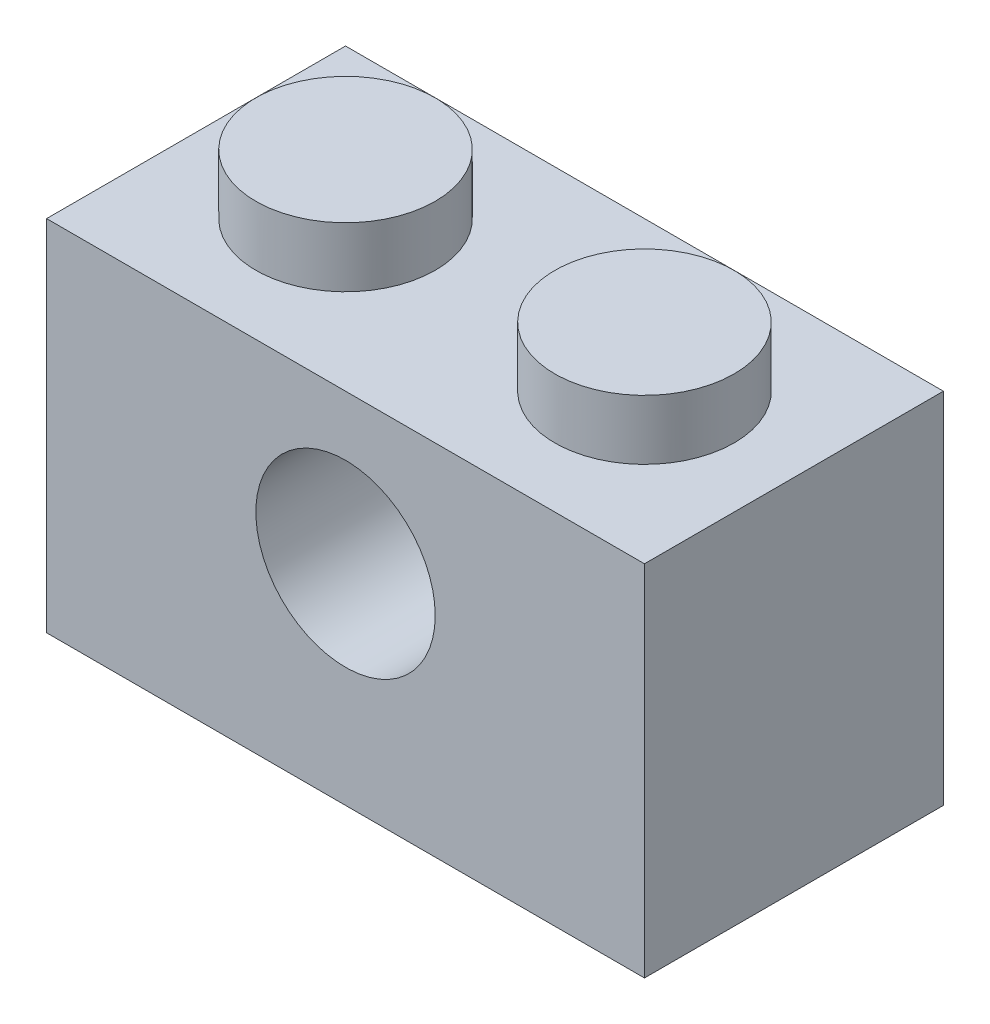
ISO-10303-21;
HEADER;
FILE_DESCRIPTION(('STEP AP214'),'2;1');
FILE_NAME('part.step','',(''),(''),'','','');
FILE_SCHEMA(('AUTOMOTIVE_DESIGN { 1 0 10303 214 1 1 1 1 }'));
ENDSEC;
DATA;
#1=APPLICATION_CONTEXT('core data for automotive mechanical design processes');
#2=APPLICATION_PROTOCOL_DEFINITION('international standard','automotive_design',2000,#1);
#3=PRODUCT_CONTEXT('',#1,'mechanical');
#4=PRODUCT('Part','Part','',(#3));
#5=PRODUCT_RELATED_PRODUCT_CATEGORY('part','',(#4));
#6=PRODUCT_DEFINITION_FORMATION('','',#4);
#7=PRODUCT_DEFINITION_CONTEXT('part definition',#1,'design');
#8=PRODUCT_DEFINITION('design','',#6,#7);
#9=PRODUCT_DEFINITION_SHAPE('','',#8);
#10=(LENGTH_UNIT() NAMED_UNIT(*) SI_UNIT(.MILLI.,.METRE.));
#11=(NAMED_UNIT(*) PLANE_ANGLE_UNIT() SI_UNIT($,.RADIAN.));
#12=(NAMED_UNIT(*) SI_UNIT($,.STERADIAN.) SOLID_ANGLE_UNIT());
#13=UNCERTAINTY_MEASURE_WITH_UNIT(LENGTH_MEASURE(1.E-05),#10,'distance_accuracy_value','');
#14=(GEOMETRIC_REPRESENTATION_CONTEXT(3) GLOBAL_UNCERTAINTY_ASSIGNED_CONTEXT((#13)) GLOBAL_UNIT_ASSIGNED_CONTEXT((#10,
#11,#12)) REPRESENTATION_CONTEXT('',''));
#15=CARTESIAN_POINT('',(0.,0.,0.));
#16=DIRECTION('',(0.,0.,1.));
#17=DIRECTION('',(1.,0.,0.));
#18=AXIS2_PLACEMENT_3D('',#15,#16,#17);
#19=CARTESIAN_POINT('',(12.,4.8,0.));
#20=DIRECTION('',(-1.,0.,0.));
#21=DIRECTION('',(0.,0.,1.));
#22=AXIS2_PLACEMENT_3D('',#19,#20,#21);
#23=PLANE('',#22);
#24=DIRECTION('',(0.,0.,-1.));
#25=VECTOR('',#24,1.);
#26=CARTESIAN_POINT('',(12.,0.,0.));
#27=LINE('',#26,#25);
#28=CARTESIAN_POINT('',(12.,0.,4.));
#29=VERTEX_POINT('',#28);
#30=CARTESIAN_POINT('',(12.,0.,-4.));
#31=VERTEX_POINT('',#30);
#32=EDGE_CURVE('E133',#29,#31,#27,.T.);
#33=ORIENTED_EDGE('',*,*,#32,.T.);
#34=DIRECTION('',(0.,-1.,0.));
#35=VECTOR('',#34,1.);
#36=CARTESIAN_POINT('',(12.,4.8,-4.));
#37=LINE('',#36,#35);
#38=CARTESIAN_POINT('',(12.,9.6,-4.));
#39=VERTEX_POINT('',#38);
#40=EDGE_CURVE('E143',#39,#31,#37,.T.);
#41=ORIENTED_EDGE('',*,*,#40,.F.);
#42=DIRECTION('',(0.,0.,-1.));
#43=VECTOR('',#42,1.);
#44=CARTESIAN_POINT('',(12.,9.6,0.));
#45=LINE('',#44,#43);
#46=CARTESIAN_POINT('',(12.,9.6,4.));
#47=VERTEX_POINT('',#46);
#48=EDGE_CURVE('E11',#47,#39,#45,.T.);
#49=ORIENTED_EDGE('',*,*,#48,.F.);
#50=DIRECTION('',(0.,1.,0.));
#51=VECTOR('',#50,1.);
#52=CARTESIAN_POINT('',(12.,4.8,4.));
#53=LINE('',#52,#51);
#54=EDGE_CURVE('E118',#29,#47,#53,.T.);
#55=ORIENTED_EDGE('',*,*,#54,.F.);
#56=EDGE_LOOP('',(#33,#41,#49,#55));
#57=FACE_BOUND('',#56,.T.);
#58=ADVANCED_FACE('F40',(#57),#23,.F.);
#59=CARTESIAN_POINT('',(4.,9.6,0.));
#60=DIRECTION('',(0.,-1.,0.));
#61=DIRECTION('',(0.,0.,-1.));
#62=AXIS2_PLACEMENT_3D('',#59,#60,#61);
#63=PLANE('',#62);
#64=ORIENTED_EDGE('',*,*,#48,.T.);
#65=DIRECTION('',(1.,0.,0.));
#66=VECTOR('',#65,1.);
#67=CARTESIAN_POINT('',(4.,9.6,-4.));
#68=LINE('',#67,#66);
#69=CARTESIAN_POINT('',(-4.,9.6,-4.));
#70=VERTEX_POINT('',#69);
#71=EDGE_CURVE('E131',#70,#39,#68,.T.);
#72=ORIENTED_EDGE('',*,*,#71,.F.);
#73=DIRECTION('',(0.,0.,-1.));
#74=VECTOR('',#73,1.);
#75=CARTESIAN_POINT('',(-4.,9.6,0.));
#76=LINE('',#75,#74);
#77=CARTESIAN_POINT('',(-4.,9.6,4.));
#78=VERTEX_POINT('',#77);
#79=EDGE_CURVE('E50',#78,#70,#76,.T.);
#80=ORIENTED_EDGE('',*,*,#79,.F.);
#81=DIRECTION('',(-1.,0.,0.));
#82=VECTOR('',#81,1.);
#83=CARTESIAN_POINT('',(4.,9.6,4.));
#84=LINE('',#83,#82);
#85=EDGE_CURVE('E142',#47,#78,#84,.T.);
#86=ORIENTED_EDGE('',*,*,#85,.F.);
#87=EDGE_LOOP('',(#64,#72,#80,#86));
#88=FACE_BOUND('',#87,.T.);
#89=CARTESIAN_POINT('',(0.,9.6,0.));
#90=DIRECTION('',(0.,-1.,0.));
#91=DIRECTION('',(1.,0.,0.));
#92=AXIS2_PLACEMENT_3D('',#89,#90,#91);
#93=CIRCLE('',#92,2.4);
#94=CARTESIAN_POINT('',(-2.4,9.6,0.));
#95=VERTEX_POINT('',#94);
#96=EDGE_CURVE('E115',#95,#95,#93,.T.);
#97=ORIENTED_EDGE('',*,*,#96,.T.);
#98=EDGE_LOOP('',(#97));
#99=FACE_BOUND('',#98,.T.);
#100=CARTESIAN_POINT('',(8.,9.6,0.));
#101=DIRECTION('',(0.,-1.,0.));
#102=DIRECTION('',(1.,0.,0.));
#103=AXIS2_PLACEMENT_3D('',#100,#101,#102);
#104=CIRCLE('',#103,2.4);
#105=CARTESIAN_POINT('',(5.6,9.6,0.));
#106=VERTEX_POINT('',#105);
#107=EDGE_CURVE('E116',#106,#106,#104,.T.);
#108=ORIENTED_EDGE('',*,*,#107,.T.);
#109=EDGE_LOOP('',(#108));
#110=FACE_BOUND('',#109,.T.);
#111=ADVANCED_FACE('F167',(#88,#99,#110),#63,.F.);
#112=CARTESIAN_POINT('',(-4.,4.8,0.));
#113=DIRECTION('',(1.,0.,0.));
#114=DIRECTION('',(0.,0.,-1.));
#115=AXIS2_PLACEMENT_3D('',#112,#113,#114);
#116=PLANE('',#115);
#117=ORIENTED_EDGE('',*,*,#79,.T.);
#118=DIRECTION('',(0.,1.,0.));
#119=VECTOR('',#118,1.);
#120=CARTESIAN_POINT('',(-4.,4.8,-4.));
#121=LINE('',#120,#119);
#122=CARTESIAN_POINT('',(-4.,0.,-4.));
#123=VERTEX_POINT('',#122);
#124=EDGE_CURVE('E148',#123,#70,#121,.T.);
#125=ORIENTED_EDGE('',*,*,#124,.F.);
#126=DIRECTION('',(0.,0.,-1.));
#127=VECTOR('',#126,1.);
#128=CARTESIAN_POINT('',(-4.,0.,0.));
#129=LINE('',#128,#127);
#130=CARTESIAN_POINT('',(-4.,0.,4.));
#131=VERTEX_POINT('',#130);
#132=EDGE_CURVE('E134',#131,#123,#129,.T.);
#133=ORIENTED_EDGE('',*,*,#132,.F.);
#134=DIRECTION('',(0.,-1.,0.));
#135=VECTOR('',#134,1.);
#136=CARTESIAN_POINT('',(-4.,4.8,4.));
#137=LINE('',#136,#135);
#138=EDGE_CURVE('E153',#78,#131,#137,.T.);
#139=ORIENTED_EDGE('',*,*,#138,.F.);
#140=EDGE_LOOP('',(#117,#125,#133,#139));
#141=FACE_BOUND('',#140,.T.);
#142=ADVANCED_FACE('F165',(#141),#116,.F.);
#143=CARTESIAN_POINT('',(4.,0.,0.));
#144=DIRECTION('',(0.,1.,0.));
#145=DIRECTION('',(0.,0.,1.));
#146=AXIS2_PLACEMENT_3D('',#143,#144,#145);
#147=PLANE('',#146);
#148=ORIENTED_EDGE('',*,*,#132,.T.);
#149=DIRECTION('',(-1.,0.,0.));
#150=VECTOR('',#149,1.);
#151=CARTESIAN_POINT('',(4.,0.,-4.));
#152=LINE('',#151,#150);
#153=EDGE_CURVE('E146',#31,#123,#152,.T.);
#154=ORIENTED_EDGE('',*,*,#153,.F.);
#155=ORIENTED_EDGE('',*,*,#32,.F.);
#156=DIRECTION('',(1.,0.,0.));
#157=VECTOR('',#156,1.);
#158=CARTESIAN_POINT('',(4.,0.,4.));
#159=LINE('',#158,#157);
#160=EDGE_CURVE('E147',#131,#29,#159,.T.);
#161=ORIENTED_EDGE('',*,*,#160,.F.);
#162=EDGE_LOOP('',(#148,#154,#155,#161));
#163=FACE_BOUND('',#162,.T.);
#164=CARTESIAN_POINT('',(0.,0.,0.));
#165=DIRECTION('',(0.,1.,0.));
#166=DIRECTION('',(1.,0.,0.));
#167=AXIS2_PLACEMENT_3D('',#164,#165,#166);
#168=CIRCLE('',#167,2.4);
#169=CARTESIAN_POINT('',(-2.4,0.,0.));
#170=VERTEX_POINT('',#169);
#171=EDGE_CURVE('E122',#170,#170,#168,.T.);
#172=ORIENTED_EDGE('',*,*,#171,.T.);
#173=EDGE_LOOP('',(#172));
#174=FACE_BOUND('',#173,.T.);
#175=CARTESIAN_POINT('',(8.,0.,0.));
#176=DIRECTION('',(0.,1.,0.));
#177=DIRECTION('',(1.,0.,0.));
#178=AXIS2_PLACEMENT_3D('',#175,#176,#177);
#179=CIRCLE('',#178,2.4);
#180=CARTESIAN_POINT('',(5.6,0.,0.));
#181=VERTEX_POINT('',#180);
#182=EDGE_CURVE('E128',#181,#181,#179,.T.);
#183=ORIENTED_EDGE('',*,*,#182,.T.);
#184=EDGE_LOOP('',(#183));
#185=FACE_BOUND('',#184,.T.);
#186=ADVANCED_FACE('F163',(#163,#174,#185),#147,.F.);
#187=CARTESIAN_POINT('',(4.,4.8,-4.));
#188=DIRECTION('',(0.,0.,1.));
#189=DIRECTION('',(1.,0.,0.));
#190=AXIS2_PLACEMENT_3D('',#187,#188,#189);
#191=PLANE('',#190);
#192=CARTESIAN_POINT('',(4.,5.6,-4.));
#193=DIRECTION('',(0.,0.,1.));
#194=DIRECTION('',(1.,0.,0.));
#195=AXIS2_PLACEMENT_3D('',#192,#193,#194);
#196=CIRCLE('',#195,2.4);
#197=CARTESIAN_POINT('',(6.4,5.6,-4.));
#198=VERTEX_POINT('',#197);
#199=EDGE_CURVE('E306',#198,#198,#196,.T.);
#200=ORIENTED_EDGE('',*,*,#199,.T.);
#201=EDGE_LOOP('',(#200));
#202=FACE_BOUND('',#201,.T.);
#203=ORIENTED_EDGE('',*,*,#40,.T.);
#204=ORIENTED_EDGE('',*,*,#153,.T.);
#205=ORIENTED_EDGE('',*,*,#124,.T.);
#206=ORIENTED_EDGE('',*,*,#71,.T.);
#207=EDGE_LOOP('',(#203,#204,#205,#206));
#208=FACE_BOUND('',#207,.T.);
#209=ADVANCED_FACE('F160',(#202,#208),#191,.F.);
#210=CARTESIAN_POINT('',(4.,4.8,4.));
#211=DIRECTION('',(0.,0.,1.));
#212=DIRECTION('',(1.,0.,0.));
#213=AXIS2_PLACEMENT_3D('',#210,#211,#212);
#214=PLANE('',#213);
#215=CARTESIAN_POINT('',(4.,5.6,4.));
#216=DIRECTION('',(0.,0.,1.));
#217=DIRECTION('',(1.,0.,0.));
#218=AXIS2_PLACEMENT_3D('',#215,#216,#217);
#219=CIRCLE('',#218,2.4);
#220=CARTESIAN_POINT('',(6.4,5.6,4.));
#221=VERTEX_POINT('',#220);
#222=EDGE_CURVE('E44',#221,#221,#219,.T.);
#223=ORIENTED_EDGE('',*,*,#222,.F.);
#224=EDGE_LOOP('',(#223));
#225=FACE_BOUND('',#224,.T.);
#226=ORIENTED_EDGE('',*,*,#54,.T.);
#227=ORIENTED_EDGE('',*,*,#85,.T.);
#228=ORIENTED_EDGE('',*,*,#138,.T.);
#229=ORIENTED_EDGE('',*,*,#160,.T.);
#230=EDGE_LOOP('',(#226,#227,#228,#229));
#231=FACE_BOUND('',#230,.T.);
#232=ADVANCED_FACE('F201',(#225,#231),#214,.T.);
#233=CARTESIAN_POINT('',(0.,11.2,0.));
#234=DIRECTION('',(0.,1.,0.));
#235=DIRECTION('',(1.,0.,0.));
#236=AXIS2_PLACEMENT_3D('',#233,#234,#235);
#237=PLANE('',#236);
#238=CARTESIAN_POINT('',(0.,11.2,0.));
#239=DIRECTION('',(0.,1.,0.));
#240=DIRECTION('',(1.,0.,0.));
#241=AXIS2_PLACEMENT_3D('',#238,#239,#240);
#242=CIRCLE('',#241,2.4);
#243=CARTESIAN_POINT('',(2.4,11.2,0.));
#244=VERTEX_POINT('',#243);
#245=EDGE_CURVE('E112',#244,#244,#242,.T.);
#246=ORIENTED_EDGE('',*,*,#245,.T.);
#247=EDGE_LOOP('',(#246));
#248=FACE_BOUND('',#247,.T.);
#249=ADVANCED_FACE('F113',(#248),#237,.T.);
#250=CARTESIAN_POINT('',(0.,10.15,0.));
#251=DIRECTION('',(0.,-1.,0.));
#252=DIRECTION('',(1.,0.,0.));
#253=AXIS2_PLACEMENT_3D('',#250,#251,#252);
#254=CYLINDRICAL_SURFACE('',#253,2.4);
#255=ORIENTED_EDGE('',*,*,#96,.F.);
#256=EDGE_LOOP('',(#255));
#257=FACE_BOUND('',#256,.T.);
#258=ORIENTED_EDGE('',*,*,#245,.F.);
#259=EDGE_LOOP('',(#258));
#260=FACE_BOUND('',#259,.T.);
#261=ADVANCED_FACE('F186',(#257,#260),#254,.T.);
#262=CARTESIAN_POINT('',(8.,11.2,0.));
#263=DIRECTION('',(0.,1.,0.));
#264=DIRECTION('',(1.,0.,0.));
#265=AXIS2_PLACEMENT_3D('',#262,#263,#264);
#266=PLANE('',#265);
#267=CARTESIAN_POINT('',(8.,11.2,0.));
#268=DIRECTION('',(0.,1.,0.));
#269=DIRECTION('',(1.,0.,0.));
#270=AXIS2_PLACEMENT_3D('',#267,#268,#269);
#271=CIRCLE('',#270,2.4);
#272=CARTESIAN_POINT('',(10.4,11.2,0.));
#273=VERTEX_POINT('',#272);
#274=EDGE_CURVE('E106',#273,#273,#271,.T.);
#275=ORIENTED_EDGE('',*,*,#274,.T.);
#276=EDGE_LOOP('',(#275));
#277=FACE_BOUND('',#276,.T.);
#278=ADVANCED_FACE('F42',(#277),#266,.T.);
#279=CARTESIAN_POINT('',(8.,10.15,0.));
#280=DIRECTION('',(0.,-1.,0.));
#281=DIRECTION('',(1.,0.,0.));
#282=AXIS2_PLACEMENT_3D('',#279,#280,#281);
#283=CYLINDRICAL_SURFACE('',#282,2.4);
#284=ORIENTED_EDGE('',*,*,#107,.F.);
#285=EDGE_LOOP('',(#284));
#286=FACE_BOUND('',#285,.T.);
#287=ORIENTED_EDGE('',*,*,#274,.F.);
#288=EDGE_LOOP('',(#287));
#289=FACE_BOUND('',#288,.T.);
#290=ADVANCED_FACE('F189',(#286,#289),#283,.T.);
#291=CARTESIAN_POINT('',(0.,1.6,0.));
#292=DIRECTION('',(0.,1.,0.));
#293=DIRECTION('',(1.,0.,0.));
#294=AXIS2_PLACEMENT_3D('',#291,#292,#293);
#295=PLANE('',#294);
#296=CARTESIAN_POINT('',(0.,1.6,0.));
#297=DIRECTION('',(0.,1.,0.));
#298=DIRECTION('',(1.,0.,0.));
#299=AXIS2_PLACEMENT_3D('',#296,#297,#298);
#300=CIRCLE('',#299,2.4);
#301=CARTESIAN_POINT('',(2.4,1.6,0.));
#302=VERTEX_POINT('',#301);
#303=EDGE_CURVE('E100',#302,#302,#300,.T.);
#304=ORIENTED_EDGE('',*,*,#303,.F.);
#305=EDGE_LOOP('',(#304));
#306=FACE_BOUND('',#305,.T.);
#307=ADVANCED_FACE('F192',(#306),#295,.F.);
#308=CARTESIAN_POINT('',(0.,0.55,0.));
#309=DIRECTION('',(0.,-1.,0.));
#310=DIRECTION('',(1.,0.,0.));
#311=AXIS2_PLACEMENT_3D('',#308,#309,#310);
#312=CYLINDRICAL_SURFACE('',#311,2.4);
#313=ORIENTED_EDGE('',*,*,#303,.T.);
#314=EDGE_LOOP('',(#313));
#315=FACE_BOUND('',#314,.T.);
#316=ORIENTED_EDGE('',*,*,#171,.F.);
#317=EDGE_LOOP('',(#316));
#318=FACE_BOUND('',#317,.T.);
#319=ADVANCED_FACE('F206',(#315,#318),#312,.F.);
#320=CARTESIAN_POINT('',(8.,1.6,0.));
#321=DIRECTION('',(0.,1.,0.));
#322=DIRECTION('',(1.,0.,0.));
#323=AXIS2_PLACEMENT_3D('',#320,#321,#322);
#324=PLANE('',#323);
#325=CARTESIAN_POINT('',(8.,1.6,0.));
#326=DIRECTION('',(0.,1.,0.));
#327=DIRECTION('',(1.,0.,0.));
#328=AXIS2_PLACEMENT_3D('',#325,#326,#327);
#329=CIRCLE('',#328,2.4);
#330=CARTESIAN_POINT('',(10.4,1.6,0.));
#331=VERTEX_POINT('',#330);
#332=EDGE_CURVE('E124',#331,#331,#329,.T.);
#333=ORIENTED_EDGE('',*,*,#332,.F.);
#334=EDGE_LOOP('',(#333));
#335=FACE_BOUND('',#334,.T.);
#336=ADVANCED_FACE('F197',(#335),#324,.F.);
#337=CARTESIAN_POINT('',(8.,0.55,0.));
#338=DIRECTION('',(0.,-1.,0.));
#339=DIRECTION('',(1.,0.,0.));
#340=AXIS2_PLACEMENT_3D('',#337,#338,#339);
#341=CYLINDRICAL_SURFACE('',#340,2.4);
#342=ORIENTED_EDGE('',*,*,#332,.T.);
#343=EDGE_LOOP('',(#342));
#344=FACE_BOUND('',#343,.T.);
#345=ORIENTED_EDGE('',*,*,#182,.F.);
#346=EDGE_LOOP('',(#345));
#347=FACE_BOUND('',#346,.T.);
#348=ADVANCED_FACE('F194',(#344,#347),#341,.F.);
#349=CARTESIAN_POINT('',(4.,5.6,-4.));
#350=DIRECTION('',(0.,0.,1.));
#351=DIRECTION('',(1.,0.,0.));
#352=AXIS2_PLACEMENT_3D('',#349,#350,#351);
#353=CYLINDRICAL_SURFACE('',#352,2.4);
#354=ORIENTED_EDGE('',*,*,#222,.T.);
#355=EDGE_LOOP('',(#354));
#356=FACE_BOUND('',#355,.T.);
#357=ORIENTED_EDGE('',*,*,#199,.F.);
#358=EDGE_LOOP('',(#357));
#359=FACE_BOUND('',#358,.T.);
#360=ADVANCED_FACE('F185',(#356,#359),#353,.F.);
#361=CLOSED_SHELL('',(#58,#111,#142,#186,#209,#232,#249,#261,#278,#290,#307,#319,#336,#348,#360));
#362=MANIFOLD_SOLID_BREP('B2',#361);
#363=ADVANCED_BREP_SHAPE_REPRESENTATION('',(#18,#362),#14);
#364=SHAPE_DEFINITION_REPRESENTATION(#9,#363);
ENDSEC;
END-ISO-10303-21;
